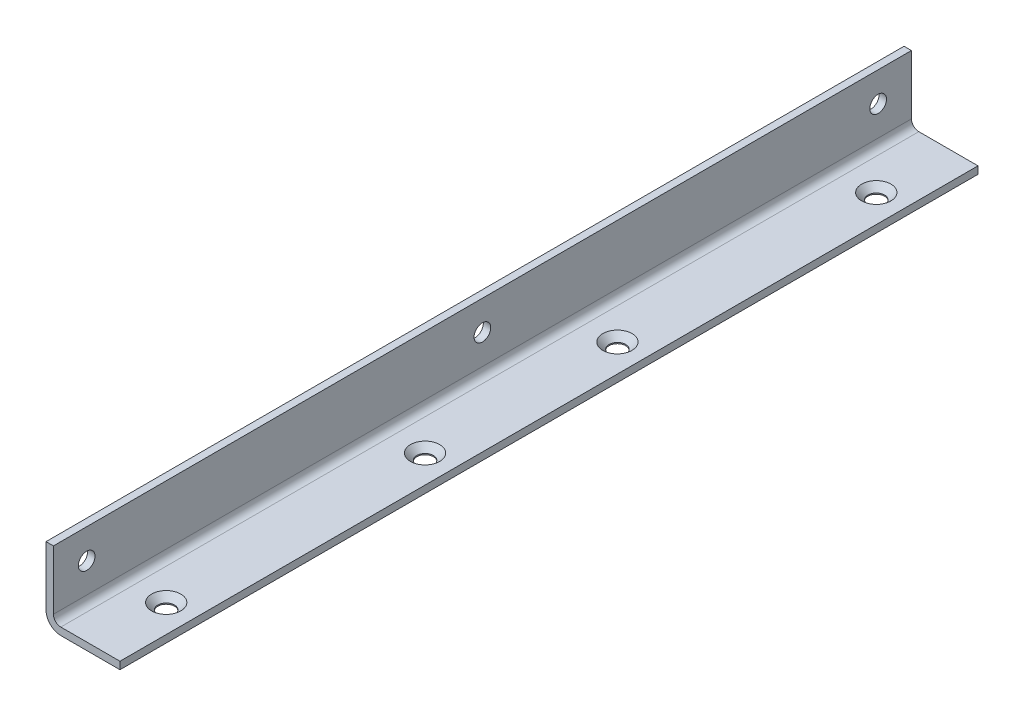
ISO-10303-21;
HEADER;
FILE_DESCRIPTION(('STEP AP214'),'2;1');
FILE_NAME('part.step','',(''),(''),'','','');
FILE_SCHEMA(('AUTOMOTIVE_DESIGN { 1 0 10303 214 1 1 1 1 }'));
ENDSEC;
DATA;
#1=APPLICATION_CONTEXT('core data for automotive mechanical design processes');
#2=APPLICATION_PROTOCOL_DEFINITION('international standard','automotive_design',2000,#1);
#3=PRODUCT_CONTEXT('',#1,'mechanical');
#4=PRODUCT('Part','Part','',(#3));
#5=PRODUCT_RELATED_PRODUCT_CATEGORY('part','',(#4));
#6=PRODUCT_DEFINITION_FORMATION('','',#4);
#7=PRODUCT_DEFINITION_CONTEXT('part definition',#1,'design');
#8=PRODUCT_DEFINITION('design','',#6,#7);
#9=PRODUCT_DEFINITION_SHAPE('','',#8);
#10=(LENGTH_UNIT() NAMED_UNIT(*) SI_UNIT(.MILLI.,.METRE.));
#11=(NAMED_UNIT(*) PLANE_ANGLE_UNIT() SI_UNIT($,.RADIAN.));
#12=(NAMED_UNIT(*) SI_UNIT($,.STERADIAN.) SOLID_ANGLE_UNIT());
#13=UNCERTAINTY_MEASURE_WITH_UNIT(LENGTH_MEASURE(1.E-05),#10,'distance_accuracy_value','');
#14=(GEOMETRIC_REPRESENTATION_CONTEXT(3) GLOBAL_UNCERTAINTY_ASSIGNED_CONTEXT((#13)) GLOBAL_UNIT_ASSIGNED_CONTEXT((#10,
#11,#12)) REPRESENTATION_CONTEXT('',''));
#15=CARTESIAN_POINT('',(0.,0.,0.));
#16=DIRECTION('',(0.,0.,1.));
#17=DIRECTION('',(1.,0.,0.));
#18=AXIS2_PLACEMENT_3D('',#15,#16,#17);
#19=CARTESIAN_POINT('',(0.,0.,232.));
#20=DIRECTION('',(1.,0.,0.));
#21=DIRECTION('',(0.,0.,-1.));
#22=AXIS2_PLACEMENT_3D('',#19,#20,#21);
#23=PLANE('',#22);
#24=CARTESIAN_POINT('',(0.,12.,116.));
#25=DIRECTION('',(1.,0.,0.));
#26=DIRECTION('',(0.,0.,-1.));
#27=AXIS2_PLACEMENT_3D('',#24,#25,#26);
#28=CIRCLE('',#27,2.25);
#29=CARTESIAN_POINT('',(0.,12.,113.75));
#30=VERTEX_POINT('',#29);
#31=EDGE_CURVE('E264',#30,#30,#28,.T.);
#32=ORIENTED_EDGE('',*,*,#31,.T.);
#33=EDGE_LOOP('',(#32));
#34=FACE_BOUND('',#33,.T.);
#35=CARTESIAN_POINT('',(0.,12.,9.00000000000001));
#36=DIRECTION('',(1.,0.,0.));
#37=DIRECTION('',(0.,0.,-1.));
#38=AXIS2_PLACEMENT_3D('',#35,#36,#37);
#39=CIRCLE('',#38,2.25);
#40=CARTESIAN_POINT('',(0.,12.,6.75000000000001));
#41=VERTEX_POINT('',#40);
#42=EDGE_CURVE('E269',#41,#41,#39,.T.);
#43=ORIENTED_EDGE('',*,*,#42,.T.);
#44=EDGE_LOOP('',(#43));
#45=FACE_BOUND('',#44,.T.);
#46=CARTESIAN_POINT('',(0.,12.,223.));
#47=DIRECTION('',(1.,0.,0.));
#48=DIRECTION('',(0.,0.,-1.));
#49=AXIS2_PLACEMENT_3D('',#46,#47,#48);
#50=CIRCLE('',#49,2.25000000000001);
#51=CARTESIAN_POINT('',(0.,12.,220.75));
#52=VERTEX_POINT('',#51);
#53=EDGE_CURVE('E135',#52,#52,#50,.T.);
#54=ORIENTED_EDGE('',*,*,#53,.T.);
#55=EDGE_LOOP('',(#54));
#56=FACE_BOUND('',#55,.T.);
#57=DIRECTION('',(0.,-1.,0.));
#58=VECTOR('',#57,1.);
#59=CARTESIAN_POINT('',(0.,0.,0.));
#60=LINE('',#59,#58);
#61=CARTESIAN_POINT('',(0.,20.,0.));
#62=VERTEX_POINT('',#61);
#63=CARTESIAN_POINT('',(0.,4.,0.));
#64=VERTEX_POINT('',#63);
#65=EDGE_CURVE('E133',#62,#64,#60,.T.);
#66=ORIENTED_EDGE('',*,*,#65,.T.);
#67=DIRECTION('',(0.,0.,-1.));
#68=VECTOR('',#67,1.);
#69=CARTESIAN_POINT('',(0.,4.,232.));
#70=LINE('',#69,#68);
#71=CARTESIAN_POINT('',(0.,4.,232.));
#72=VERTEX_POINT('',#71);
#73=EDGE_CURVE('E41',#64,#72,#70,.F.);
#74=ORIENTED_EDGE('',*,*,#73,.T.);
#75=DIRECTION('',(0.,-1.,0.));
#76=VECTOR('',#75,1.);
#77=CARTESIAN_POINT('',(0.,0.,232.));
#78=LINE('',#77,#76);
#79=CARTESIAN_POINT('',(0.,20.,232.));
#80=VERTEX_POINT('',#79);
#81=EDGE_CURVE('E107',#80,#72,#78,.T.);
#82=ORIENTED_EDGE('',*,*,#81,.F.);
#83=DIRECTION('',(0.,0.,-1.));
#84=VECTOR('',#83,1.);
#85=CARTESIAN_POINT('',(0.,20.,232.));
#86=LINE('',#85,#84);
#87=EDGE_CURVE('E132',#80,#62,#86,.T.);
#88=ORIENTED_EDGE('',*,*,#87,.T.);
#89=EDGE_LOOP('',(#66,#74,#82,#88));
#90=FACE_BOUND('',#89,.T.);
#91=ADVANCED_FACE('F33',(#34,#45,#56,#90),#23,.F.);
#92=CARTESIAN_POINT('',(0.,0.,232.));
#93=DIRECTION('',(0.,1.,0.));
#94=DIRECTION('',(0.,0.,1.));
#95=AXIS2_PLACEMENT_3D('',#92,#93,#94);
#96=PLANE('',#95);
#97=CARTESIAN_POINT('',(12.5,0.,90.));
#98=DIRECTION('',(0.,1.,0.));
#99=DIRECTION('',(0.,0.,1.));
#100=AXIS2_PLACEMENT_3D('',#97,#98,#99);
#101=CIRCLE('',#100,2.25);
#102=CARTESIAN_POINT('',(12.5,0.,92.25));
#103=VERTEX_POINT('',#102);
#104=EDGE_CURVE('E258',#103,#103,#101,.T.);
#105=ORIENTED_EDGE('',*,*,#104,.T.);
#106=EDGE_LOOP('',(#105));
#107=FACE_BOUND('',#106,.T.);
#108=CARTESIAN_POINT('',(12.5,0.,20.));
#109=DIRECTION('',(0.,1.,0.));
#110=DIRECTION('',(0.,0.,1.));
#111=AXIS2_PLACEMENT_3D('',#108,#109,#110);
#112=CIRCLE('',#111,2.25);
#113=CARTESIAN_POINT('',(12.5,0.,22.25));
#114=VERTEX_POINT('',#113);
#115=EDGE_CURVE('E252',#114,#114,#112,.T.);
#116=ORIENTED_EDGE('',*,*,#115,.T.);
#117=EDGE_LOOP('',(#116));
#118=FACE_BOUND('',#117,.T.);
#119=CARTESIAN_POINT('',(12.5,0.,142.));
#120=DIRECTION('',(0.,1.,0.));
#121=DIRECTION('',(0.,0.,1.));
#122=AXIS2_PLACEMENT_3D('',#119,#120,#121);
#123=CIRCLE('',#122,2.25);
#124=CARTESIAN_POINT('',(12.5,0.,144.25));
#125=VERTEX_POINT('',#124);
#126=EDGE_CURVE('E249',#125,#125,#123,.T.);
#127=ORIENTED_EDGE('',*,*,#126,.T.);
#128=EDGE_LOOP('',(#127));
#129=FACE_BOUND('',#128,.T.);
#130=CARTESIAN_POINT('',(12.5,0.,212.));
#131=DIRECTION('',(0.,1.,0.));
#132=DIRECTION('',(0.,0.,1.));
#133=AXIS2_PLACEMENT_3D('',#130,#131,#132);
#134=CIRCLE('',#133,2.25);
#135=CARTESIAN_POINT('',(12.5,0.,214.25));
#136=VERTEX_POINT('',#135);
#137=EDGE_CURVE('E251',#136,#136,#134,.T.);
#138=ORIENTED_EDGE('',*,*,#137,.T.);
#139=EDGE_LOOP('',(#138));
#140=FACE_BOUND('',#139,.T.);
#141=DIRECTION('',(1.,0.,0.));
#142=VECTOR('',#141,1.);
#143=CARTESIAN_POINT('',(0.,0.,232.));
#144=LINE('',#143,#142);
#145=CARTESIAN_POINT('',(4.,0.,232.));
#146=VERTEX_POINT('',#145);
#147=CARTESIAN_POINT('',(20.,0.,232.));
#148=VERTEX_POINT('',#147);
#149=EDGE_CURVE('E97',#146,#148,#144,.T.);
#150=ORIENTED_EDGE('',*,*,#149,.F.);
#151=DIRECTION('',(0.,0.,-1.));
#152=VECTOR('',#151,1.);
#153=CARTESIAN_POINT('',(4.,0.,232.));
#154=LINE('',#153,#152);
#155=CARTESIAN_POINT('',(4.,0.,0.));
#156=VERTEX_POINT('',#155);
#157=EDGE_CURVE('E182',#146,#156,#154,.T.);
#158=ORIENTED_EDGE('',*,*,#157,.T.);
#159=DIRECTION('',(1.,0.,0.));
#160=VECTOR('',#159,1.);
#161=CARTESIAN_POINT('',(0.,0.,0.));
#162=LINE('',#161,#160);
#163=CARTESIAN_POINT('',(20.,0.,0.));
#164=VERTEX_POINT('',#163);
#165=EDGE_CURVE('E112',#156,#164,#162,.T.);
#166=ORIENTED_EDGE('',*,*,#165,.T.);
#167=DIRECTION('',(0.,0.,-1.));
#168=VECTOR('',#167,1.);
#169=CARTESIAN_POINT('',(20.,0.,232.));
#170=LINE('',#169,#168);
#171=EDGE_CURVE('E110',#148,#164,#170,.T.);
#172=ORIENTED_EDGE('',*,*,#171,.F.);
#173=EDGE_LOOP('',(#150,#158,#166,#172));
#174=FACE_BOUND('',#173,.T.);
#175=ADVANCED_FACE('F111',(#107,#118,#129,#140,#174),#96,.F.);
#176=CARTESIAN_POINT('',(20.,0.,232.));
#177=DIRECTION('',(-1.,0.,0.));
#178=DIRECTION('',(0.,0.,1.));
#179=AXIS2_PLACEMENT_3D('',#176,#177,#178);
#180=PLANE('',#179);
#181=DIRECTION('',(0.,1.,0.));
#182=VECTOR('',#181,1.);
#183=CARTESIAN_POINT('',(20.,0.,0.));
#184=LINE('',#183,#182);
#185=CARTESIAN_POINT('',(20.,2.,0.));
#186=VERTEX_POINT('',#185);
#187=EDGE_CURVE('E137',#164,#186,#184,.T.);
#188=ORIENTED_EDGE('',*,*,#187,.T.);
#189=DIRECTION('',(0.,0.,-1.));
#190=VECTOR('',#189,1.);
#191=CARTESIAN_POINT('',(20.,2.,232.));
#192=LINE('',#191,#190);
#193=CARTESIAN_POINT('',(20.,2.,232.));
#194=VERTEX_POINT('',#193);
#195=EDGE_CURVE('E116',#194,#186,#192,.T.);
#196=ORIENTED_EDGE('',*,*,#195,.F.);
#197=DIRECTION('',(0.,1.,0.));
#198=VECTOR('',#197,1.);
#199=CARTESIAN_POINT('',(20.,0.,232.));
#200=LINE('',#199,#198);
#201=EDGE_CURVE('E101',#148,#194,#200,.T.);
#202=ORIENTED_EDGE('',*,*,#201,.F.);
#203=ORIENTED_EDGE('',*,*,#171,.T.);
#204=EDGE_LOOP('',(#188,#196,#202,#203));
#205=FACE_BOUND('',#204,.T.);
#206=ADVANCED_FACE('F118',(#205),#180,.F.);
#207=CARTESIAN_POINT('',(4.00000000000001,2.,232.));
#208=DIRECTION('',(0.,-1.,0.));
#209=DIRECTION('',(0.,0.,-1.));
#210=AXIS2_PLACEMENT_3D('',#207,#208,#209);
#211=PLANE('',#210);
#212=CARTESIAN_POINT('',(12.5,2.,20.));
#213=DIRECTION('',(0.,-1.,0.));
#214=DIRECTION('',(0.,0.,-1.));
#215=AXIS2_PLACEMENT_3D('',#212,#213,#214);
#216=CIRCLE('',#215,3.95000000000001);
#217=CARTESIAN_POINT('',(12.5,2.,16.05));
#218=VERTEX_POINT('',#217);
#219=EDGE_CURVE('E170',#218,#218,#216,.T.);
#220=ORIENTED_EDGE('',*,*,#219,.T.);
#221=EDGE_LOOP('',(#220));
#222=FACE_BOUND('',#221,.T.);
#223=CARTESIAN_POINT('',(12.5,2.,90.));
#224=DIRECTION('',(0.,-1.,0.));
#225=DIRECTION('',(0.,0.,-1.));
#226=AXIS2_PLACEMENT_3D('',#223,#224,#225);
#227=CIRCLE('',#226,3.95000000000001);
#228=CARTESIAN_POINT('',(12.5,2.,86.05));
#229=VERTEX_POINT('',#228);
#230=EDGE_CURVE('E167',#229,#229,#227,.T.);
#231=ORIENTED_EDGE('',*,*,#230,.T.);
#232=EDGE_LOOP('',(#231));
#233=FACE_BOUND('',#232,.T.);
#234=CARTESIAN_POINT('',(12.5,2.,142.));
#235=DIRECTION('',(0.,-1.,0.));
#236=DIRECTION('',(0.,0.,-1.));
#237=AXIS2_PLACEMENT_3D('',#234,#235,#236);
#238=CIRCLE('',#237,3.95000000000001);
#239=CARTESIAN_POINT('',(12.5,2.,138.05));
#240=VERTEX_POINT('',#239);
#241=EDGE_CURVE('E164',#240,#240,#238,.T.);
#242=ORIENTED_EDGE('',*,*,#241,.T.);
#243=EDGE_LOOP('',(#242));
#244=FACE_BOUND('',#243,.T.);
#245=CARTESIAN_POINT('',(12.5,2.,212.));
#246=DIRECTION('',(0.,-1.,0.));
#247=DIRECTION('',(0.,0.,-1.));
#248=AXIS2_PLACEMENT_3D('',#245,#246,#247);
#249=CIRCLE('',#248,3.95000000000001);
#250=CARTESIAN_POINT('',(12.5,2.,208.05));
#251=VERTEX_POINT('',#250);
#252=EDGE_CURVE('E161',#251,#251,#249,.T.);
#253=ORIENTED_EDGE('',*,*,#252,.T.);
#254=EDGE_LOOP('',(#253));
#255=FACE_BOUND('',#254,.T.);
#256=DIRECTION('',(-1.,0.,0.));
#257=VECTOR('',#256,1.);
#258=CARTESIAN_POINT('',(4.00000000000001,2.,0.));
#259=LINE('',#258,#257);
#260=CARTESIAN_POINT('',(4.00000000000001,2.,0.));
#261=VERTEX_POINT('',#260);
#262=EDGE_CURVE('E139',#186,#261,#259,.T.);
#263=ORIENTED_EDGE('',*,*,#262,.T.);
#264=DIRECTION('',(0.,0.,-1.));
#265=VECTOR('',#264,1.);
#266=CARTESIAN_POINT('',(4.00000000000001,2.,232.));
#267=LINE('',#266,#265);
#268=CARTESIAN_POINT('',(4.00000000000001,2.,232.));
#269=VERTEX_POINT('',#268);
#270=EDGE_CURVE('E155',#269,#261,#267,.T.);
#271=ORIENTED_EDGE('',*,*,#270,.F.);
#272=DIRECTION('',(-1.,0.,0.));
#273=VECTOR('',#272,1.);
#274=CARTESIAN_POINT('',(4.00000000000001,2.,232.));
#275=LINE('',#274,#273);
#276=EDGE_CURVE('E121',#194,#269,#275,.T.);
#277=ORIENTED_EDGE('',*,*,#276,.F.);
#278=ORIENTED_EDGE('',*,*,#195,.T.);
#279=EDGE_LOOP('',(#263,#271,#277,#278));
#280=FACE_BOUND('',#279,.T.);
#281=ADVANCED_FACE('F189',(#222,#233,#244,#255,#280),#211,.F.);
#282=CARTESIAN_POINT('',(4.,4.,232.));
#283=DIRECTION('',(0.,0.,-1.));
#284=DIRECTION('',(-1.,0.,0.));
#285=AXIS2_PLACEMENT_3D('',#282,#283,#284);
#286=CYLINDRICAL_SURFACE('',#285,2.);
#287=CARTESIAN_POINT('',(4.,4.,0.));
#288=DIRECTION('',(0.,0.,-1.));
#289=DIRECTION('',(-1.,0.,0.));
#290=AXIS2_PLACEMENT_3D('',#287,#288,#289);
#291=CIRCLE('',#290,2.);
#292=CARTESIAN_POINT('',(2.,4.00000000000001,0.));
#293=VERTEX_POINT('',#292);
#294=EDGE_CURVE('E141',#261,#293,#291,.T.);
#295=ORIENTED_EDGE('',*,*,#294,.T.);
#296=DIRECTION('',(0.,0.,-1.));
#297=VECTOR('',#296,1.);
#298=CARTESIAN_POINT('',(2.,4.00000000000001,232.));
#299=LINE('',#298,#297);
#300=CARTESIAN_POINT('',(2.,4.00000000000001,232.));
#301=VERTEX_POINT('',#300);
#302=EDGE_CURVE('E152',#301,#293,#299,.T.);
#303=ORIENTED_EDGE('',*,*,#302,.F.);
#304=CARTESIAN_POINT('',(4.,4.,232.));
#305=DIRECTION('',(0.,0.,-1.));
#306=DIRECTION('',(-1.,0.,0.));
#307=AXIS2_PLACEMENT_3D('',#304,#305,#306);
#308=CIRCLE('',#307,2.);
#309=EDGE_CURVE('E123',#269,#301,#308,.T.);
#310=ORIENTED_EDGE('',*,*,#309,.F.);
#311=ORIENTED_EDGE('',*,*,#270,.T.);
#312=EDGE_LOOP('',(#295,#303,#310,#311));
#313=FACE_BOUND('',#312,.T.);
#314=ADVANCED_FACE('F196',(#313),#286,.F.);
#315=CARTESIAN_POINT('',(2.,4.00000000000001,232.));
#316=DIRECTION('',(-1.,0.,0.));
#317=DIRECTION('',(0.,0.,1.));
#318=AXIS2_PLACEMENT_3D('',#315,#316,#317);
#319=PLANE('',#318);
#320=CARTESIAN_POINT('',(2.,12.,116.));
#321=DIRECTION('',(1.,0.,0.));
#322=DIRECTION('',(0.,0.,-1.));
#323=AXIS2_PLACEMENT_3D('',#320,#321,#322);
#324=CIRCLE('',#323,2.25);
#325=CARTESIAN_POINT('',(2.,12.,113.75));
#326=VERTEX_POINT('',#325);
#327=EDGE_CURVE('E255',#326,#326,#324,.T.);
#328=ORIENTED_EDGE('',*,*,#327,.F.);
#329=EDGE_LOOP('',(#328));
#330=FACE_BOUND('',#329,.T.);
#331=CARTESIAN_POINT('',(2.,12.,9.00000000000001));
#332=DIRECTION('',(1.,0.,0.));
#333=DIRECTION('',(0.,0.,1.));
#334=AXIS2_PLACEMENT_3D('',#331,#332,#333);
#335=CIRCLE('',#334,2.25);
#336=CARTESIAN_POINT('',(2.,12.,11.25));
#337=VERTEX_POINT('',#336);
#338=EDGE_CURVE('E266',#337,#337,#335,.T.);
#339=ORIENTED_EDGE('',*,*,#338,.F.);
#340=EDGE_LOOP('',(#339));
#341=FACE_BOUND('',#340,.T.);
#342=CARTESIAN_POINT('',(2.,12.,223.));
#343=DIRECTION('',(1.,0.,0.));
#344=DIRECTION('',(0.,0.,-1.));
#345=AXIS2_PLACEMENT_3D('',#342,#343,#344);
#346=CIRCLE('',#345,2.25000000000001);
#347=CARTESIAN_POINT('',(2.,12.,220.75));
#348=VERTEX_POINT('',#347);
#349=EDGE_CURVE('E272',#348,#348,#346,.T.);
#350=ORIENTED_EDGE('',*,*,#349,.F.);
#351=EDGE_LOOP('',(#350));
#352=FACE_BOUND('',#351,.T.);
#353=DIRECTION('',(0.,1.,0.));
#354=VECTOR('',#353,1.);
#355=CARTESIAN_POINT('',(2.,4.00000000000001,0.));
#356=LINE('',#355,#354);
#357=CARTESIAN_POINT('',(2.,20.,0.));
#358=VERTEX_POINT('',#357);
#359=EDGE_CURVE('E143',#293,#358,#356,.T.);
#360=ORIENTED_EDGE('',*,*,#359,.T.);
#361=DIRECTION('',(0.,0.,-1.));
#362=VECTOR('',#361,1.);
#363=CARTESIAN_POINT('',(2.,20.,232.));
#364=LINE('',#363,#362);
#365=CARTESIAN_POINT('',(2.,20.,232.));
#366=VERTEX_POINT('',#365);
#367=EDGE_CURVE('E149',#366,#358,#364,.T.);
#368=ORIENTED_EDGE('',*,*,#367,.F.);
#369=DIRECTION('',(0.,1.,0.));
#370=VECTOR('',#369,1.);
#371=CARTESIAN_POINT('',(2.,4.00000000000001,232.));
#372=LINE('',#371,#370);
#373=EDGE_CURVE('E128',#301,#366,#372,.T.);
#374=ORIENTED_EDGE('',*,*,#373,.F.);
#375=ORIENTED_EDGE('',*,*,#302,.T.);
#376=EDGE_LOOP('',(#360,#368,#374,#375));
#377=FACE_BOUND('',#376,.T.);
#378=ADVANCED_FACE('F199',(#330,#341,#352,#377),#319,.F.);
#379=CARTESIAN_POINT('',(0.,20.,232.));
#380=DIRECTION('',(0.,-1.,0.));
#381=DIRECTION('',(0.,0.,-1.));
#382=AXIS2_PLACEMENT_3D('',#379,#380,#381);
#383=PLANE('',#382);
#384=DIRECTION('',(-1.,0.,0.));
#385=VECTOR('',#384,1.);
#386=CARTESIAN_POINT('',(0.,20.,0.));
#387=LINE('',#386,#385);
#388=EDGE_CURVE('E145',#358,#62,#387,.T.);
#389=ORIENTED_EDGE('',*,*,#388,.T.);
#390=ORIENTED_EDGE('',*,*,#87,.F.);
#391=DIRECTION('',(-1.,0.,0.));
#392=VECTOR('',#391,1.);
#393=CARTESIAN_POINT('',(0.,20.,232.));
#394=LINE('',#393,#392);
#395=EDGE_CURVE('E130',#366,#80,#394,.T.);
#396=ORIENTED_EDGE('',*,*,#395,.F.);
#397=ORIENTED_EDGE('',*,*,#367,.T.);
#398=EDGE_LOOP('',(#389,#390,#396,#397));
#399=FACE_BOUND('',#398,.T.);
#400=ADVANCED_FACE('F204',(#399),#383,.F.);
#401=CARTESIAN_POINT('',(4.,4.,232.));
#402=DIRECTION('',(0.,0.,-1.));
#403=DIRECTION('',(-1.,0.,0.));
#404=AXIS2_PLACEMENT_3D('',#401,#402,#403);
#405=PLANE('',#404);
#406=ORIENTED_EDGE('',*,*,#81,.T.);
#407=CARTESIAN_POINT('',(4.,4.,232.));
#408=DIRECTION('',(0.,0.,-1.));
#409=DIRECTION('',(-1.,0.,0.));
#410=AXIS2_PLACEMENT_3D('',#407,#408,#409);
#411=CIRCLE('',#410,4.);
#412=EDGE_CURVE('E11',#72,#146,#411,.F.);
#413=ORIENTED_EDGE('',*,*,#412,.T.);
#414=ORIENTED_EDGE('',*,*,#149,.T.);
#415=ORIENTED_EDGE('',*,*,#201,.T.);
#416=ORIENTED_EDGE('',*,*,#276,.T.);
#417=ORIENTED_EDGE('',*,*,#309,.T.);
#418=ORIENTED_EDGE('',*,*,#373,.T.);
#419=ORIENTED_EDGE('',*,*,#395,.T.);
#420=EDGE_LOOP('',(#406,#413,#414,#415,#416,#417,#418,#419));
#421=FACE_BOUND('',#420,.T.);
#422=ADVANCED_FACE('F99',(#421),#405,.F.);
#423=CARTESIAN_POINT('',(4.,4.,0.));
#424=DIRECTION('',(0.,0.,-1.));
#425=DIRECTION('',(-1.,0.,0.));
#426=AXIS2_PLACEMENT_3D('',#423,#424,#425);
#427=PLANE('',#426);
#428=ORIENTED_EDGE('',*,*,#165,.F.);
#429=CARTESIAN_POINT('',(4.,4.,0.));
#430=DIRECTION('',(0.,0.,-1.));
#431=DIRECTION('',(-1.,0.,0.));
#432=AXIS2_PLACEMENT_3D('',#429,#430,#431);
#433=CIRCLE('',#432,4.);
#434=EDGE_CURVE('E55',#156,#64,#433,.T.);
#435=ORIENTED_EDGE('',*,*,#434,.T.);
#436=ORIENTED_EDGE('',*,*,#65,.F.);
#437=ORIENTED_EDGE('',*,*,#388,.F.);
#438=ORIENTED_EDGE('',*,*,#359,.F.);
#439=ORIENTED_EDGE('',*,*,#294,.F.);
#440=ORIENTED_EDGE('',*,*,#262,.F.);
#441=ORIENTED_EDGE('',*,*,#187,.F.);
#442=EDGE_LOOP('',(#428,#435,#436,#437,#438,#439,#440,#441));
#443=FACE_BOUND('',#442,.T.);
#444=ADVANCED_FACE('F185',(#443),#427,.T.);
#445=CARTESIAN_POINT('',(-8.,12.,223.));
#446=DIRECTION('',(1.,0.,0.));
#447=DIRECTION('',(0.,0.,-1.));
#448=AXIS2_PLACEMENT_3D('',#445,#446,#447);
#449=CYLINDRICAL_SURFACE('',#448,2.25000000000001);
#450=ORIENTED_EDGE('',*,*,#349,.T.);
#451=EDGE_LOOP('',(#450));
#452=FACE_BOUND('',#451,.T.);
#453=ORIENTED_EDGE('',*,*,#53,.F.);
#454=EDGE_LOOP('',(#453));
#455=FACE_BOUND('',#454,.T.);
#456=ADVANCED_FACE('F279',(#452,#455),#449,.F.);
#457=CARTESIAN_POINT('',(-8.,12.,9.00000000000001));
#458=DIRECTION('',(1.,0.,0.));
#459=DIRECTION('',(0.,0.,-1.));
#460=AXIS2_PLACEMENT_3D('',#457,#458,#459);
#461=CYLINDRICAL_SURFACE('',#460,2.25);
#462=ORIENTED_EDGE('',*,*,#338,.T.);
#463=EDGE_LOOP('',(#462));
#464=FACE_BOUND('',#463,.T.);
#465=ORIENTED_EDGE('',*,*,#42,.F.);
#466=EDGE_LOOP('',(#465));
#467=FACE_BOUND('',#466,.T.);
#468=ADVANCED_FACE('F281',(#464,#467),#461,.F.);
#469=CARTESIAN_POINT('',(-8.,12.,116.));
#470=DIRECTION('',(1.,0.,0.));
#471=DIRECTION('',(0.,0.,-1.));
#472=AXIS2_PLACEMENT_3D('',#469,#470,#471);
#473=CYLINDRICAL_SURFACE('',#472,2.25);
#474=ORIENTED_EDGE('',*,*,#327,.T.);
#475=EDGE_LOOP('',(#474));
#476=FACE_BOUND('',#475,.T.);
#477=ORIENTED_EDGE('',*,*,#31,.F.);
#478=EDGE_LOOP('',(#477));
#479=FACE_BOUND('',#478,.T.);
#480=ADVANCED_FACE('F288',(#476,#479),#473,.F.);
#481=CARTESIAN_POINT('',(12.5,-8.,212.));
#482=DIRECTION('',(0.,1.,0.));
#483=DIRECTION('',(0.,0.,1.));
#484=AXIS2_PLACEMENT_3D('',#481,#482,#483);
#485=CYLINDRICAL_SURFACE('',#484,2.25);
#486=CARTESIAN_POINT('',(12.5,0.300000000000016,212.));
#487=DIRECTION('',(0.,-1.,0.));
#488=DIRECTION('',(0.,0.,-1.));
#489=AXIS2_PLACEMENT_3D('',#486,#487,#488);
#490=CIRCLE('',#489,2.25);
#491=CARTESIAN_POINT('',(12.5,0.300000000000016,209.75));
#492=VERTEX_POINT('',#491);
#493=EDGE_CURVE('E179',#492,#492,#490,.F.);
#494=ORIENTED_EDGE('',*,*,#493,.T.);
#495=EDGE_LOOP('',(#494));
#496=FACE_BOUND('',#495,.T.);
#497=ORIENTED_EDGE('',*,*,#137,.F.);
#498=EDGE_LOOP('',(#497));
#499=FACE_BOUND('',#498,.T.);
#500=ADVANCED_FACE('F245',(#496,#499),#485,.F.);
#501=CARTESIAN_POINT('',(12.5,-8.,142.));
#502=DIRECTION('',(0.,1.,0.));
#503=DIRECTION('',(0.,0.,1.));
#504=AXIS2_PLACEMENT_3D('',#501,#502,#503);
#505=CYLINDRICAL_SURFACE('',#504,2.25);
#506=CARTESIAN_POINT('',(12.5,0.300000000000016,142.));
#507=DIRECTION('',(0.,-1.,0.));
#508=DIRECTION('',(0.,0.,-1.));
#509=AXIS2_PLACEMENT_3D('',#506,#507,#508);
#510=CIRCLE('',#509,2.25);
#511=CARTESIAN_POINT('',(12.5,0.300000000000016,139.75));
#512=VERTEX_POINT('',#511);
#513=EDGE_CURVE('E176',#512,#512,#510,.F.);
#514=ORIENTED_EDGE('',*,*,#513,.T.);
#515=EDGE_LOOP('',(#514));
#516=FACE_BOUND('',#515,.T.);
#517=ORIENTED_EDGE('',*,*,#126,.F.);
#518=EDGE_LOOP('',(#517));
#519=FACE_BOUND('',#518,.T.);
#520=ADVANCED_FACE('F241',(#516,#519),#505,.F.);
#521=CARTESIAN_POINT('',(12.5,-8.,20.));
#522=DIRECTION('',(0.,1.,0.));
#523=DIRECTION('',(0.,0.,1.));
#524=AXIS2_PLACEMENT_3D('',#521,#522,#523);
#525=CYLINDRICAL_SURFACE('',#524,2.25);
#526=CARTESIAN_POINT('',(12.5,0.300000000000016,20.));
#527=DIRECTION('',(0.,-1.,0.));
#528=DIRECTION('',(0.,0.,-1.));
#529=AXIS2_PLACEMENT_3D('',#526,#527,#528);
#530=CIRCLE('',#529,2.25);
#531=CARTESIAN_POINT('',(12.5,0.300000000000016,17.75));
#532=VERTEX_POINT('',#531);
#533=EDGE_CURVE('E115',#532,#532,#530,.F.);
#534=ORIENTED_EDGE('',*,*,#533,.T.);
#535=EDGE_LOOP('',(#534));
#536=FACE_BOUND('',#535,.T.);
#537=ORIENTED_EDGE('',*,*,#115,.F.);
#538=EDGE_LOOP('',(#537));
#539=FACE_BOUND('',#538,.T.);
#540=ADVANCED_FACE('F244',(#536,#539),#525,.F.);
#541=CARTESIAN_POINT('',(12.5,-8.,90.));
#542=DIRECTION('',(0.,1.,0.));
#543=DIRECTION('',(0.,0.,1.));
#544=AXIS2_PLACEMENT_3D('',#541,#542,#543);
#545=CYLINDRICAL_SURFACE('',#544,2.25);
#546=CARTESIAN_POINT('',(12.5,0.300000000000016,90.));
#547=DIRECTION('',(0.,-1.,0.));
#548=DIRECTION('',(0.,0.,-1.));
#549=AXIS2_PLACEMENT_3D('',#546,#547,#548);
#550=CIRCLE('',#549,2.25);
#551=CARTESIAN_POINT('',(12.5,0.300000000000016,87.75));
#552=VERTEX_POINT('',#551);
#553=EDGE_CURVE('E173',#552,#552,#550,.F.);
#554=ORIENTED_EDGE('',*,*,#553,.T.);
#555=EDGE_LOOP('',(#554));
#556=FACE_BOUND('',#555,.T.);
#557=ORIENTED_EDGE('',*,*,#104,.F.);
#558=EDGE_LOOP('',(#557));
#559=FACE_BOUND('',#558,.T.);
#560=ADVANCED_FACE('F228',(#556,#559),#545,.F.);
#561=CARTESIAN_POINT('',(12.5,0.300000000000016,20.));
#562=DIRECTION('',(0.,1.,0.));
#563=DIRECTION('',(0.,0.,1.));
#564=AXIS2_PLACEMENT_3D('',#561,#562,#563);
#565=CONICAL_SURFACE('',#564,2.25,0.785398163397454);
#566=ORIENTED_EDGE('',*,*,#219,.F.);
#567=EDGE_LOOP('',(#566));
#568=FACE_BOUND('',#567,.T.);
#569=ORIENTED_EDGE('',*,*,#533,.F.);
#570=EDGE_LOOP('',(#569));
#571=FACE_BOUND('',#570,.T.);
#572=ADVANCED_FACE('F224',(#568,#571),#565,.F.);
#573=CARTESIAN_POINT('',(12.5,0.300000000000016,90.));
#574=DIRECTION('',(0.,1.,0.));
#575=DIRECTION('',(0.,0.,1.));
#576=AXIS2_PLACEMENT_3D('',#573,#574,#575);
#577=CONICAL_SURFACE('',#576,2.25,0.785398163397454);
#578=ORIENTED_EDGE('',*,*,#230,.F.);
#579=EDGE_LOOP('',(#578));
#580=FACE_BOUND('',#579,.T.);
#581=ORIENTED_EDGE('',*,*,#553,.F.);
#582=EDGE_LOOP('',(#581));
#583=FACE_BOUND('',#582,.T.);
#584=ADVANCED_FACE('F227',(#580,#583),#577,.F.);
#585=CARTESIAN_POINT('',(12.5,0.300000000000016,142.));
#586=DIRECTION('',(0.,1.,0.));
#587=DIRECTION('',(0.,0.,1.));
#588=AXIS2_PLACEMENT_3D('',#585,#586,#587);
#589=CONICAL_SURFACE('',#588,2.25,0.785398163397454);
#590=ORIENTED_EDGE('',*,*,#241,.F.);
#591=EDGE_LOOP('',(#590));
#592=FACE_BOUND('',#591,.T.);
#593=ORIENTED_EDGE('',*,*,#513,.F.);
#594=EDGE_LOOP('',(#593));
#595=FACE_BOUND('',#594,.T.);
#596=ADVANCED_FACE('F210',(#592,#595),#589,.F.);
#597=CARTESIAN_POINT('',(12.5,0.300000000000016,212.));
#598=DIRECTION('',(0.,1.,0.));
#599=DIRECTION('',(0.,0.,1.));
#600=AXIS2_PLACEMENT_3D('',#597,#598,#599);
#601=CONICAL_SURFACE('',#600,2.25,0.785398163397454);
#602=ORIENTED_EDGE('',*,*,#252,.F.);
#603=EDGE_LOOP('',(#602));
#604=FACE_BOUND('',#603,.T.);
#605=ORIENTED_EDGE('',*,*,#493,.F.);
#606=EDGE_LOOP('',(#605));
#607=FACE_BOUND('',#606,.T.);
#608=ADVANCED_FACE('F206',(#604,#607),#601,.F.);
#609=CARTESIAN_POINT('',(4.,4.,232.));
#610=DIRECTION('',(0.,0.,-1.));
#611=DIRECTION('',(-1.,0.,0.));
#612=AXIS2_PLACEMENT_3D('',#609,#610,#611);
#613=CYLINDRICAL_SURFACE('',#612,4.);
#614=ORIENTED_EDGE('',*,*,#412,.F.);
#615=ORIENTED_EDGE('',*,*,#73,.F.);
#616=ORIENTED_EDGE('',*,*,#434,.F.);
#617=ORIENTED_EDGE('',*,*,#157,.F.);
#618=EDGE_LOOP('',(#614,#615,#616,#617));
#619=FACE_BOUND('',#618,.T.);
#620=ADVANCED_FACE('F35',(#619),#613,.T.);
#621=CLOSED_SHELL('',(#91,#175,#206,#281,#314,#378,#400,#422,#444,#456,#468,#480,#500,#520,#540,
#560,#572,#584,#596,#608,#620));
#622=MANIFOLD_SOLID_BREP('B2',#621);
#623=ADVANCED_BREP_SHAPE_REPRESENTATION('',(#18,#622),#14);
#624=SHAPE_DEFINITION_REPRESENTATION(#9,#623);
ENDSEC;
END-ISO-10303-21;
